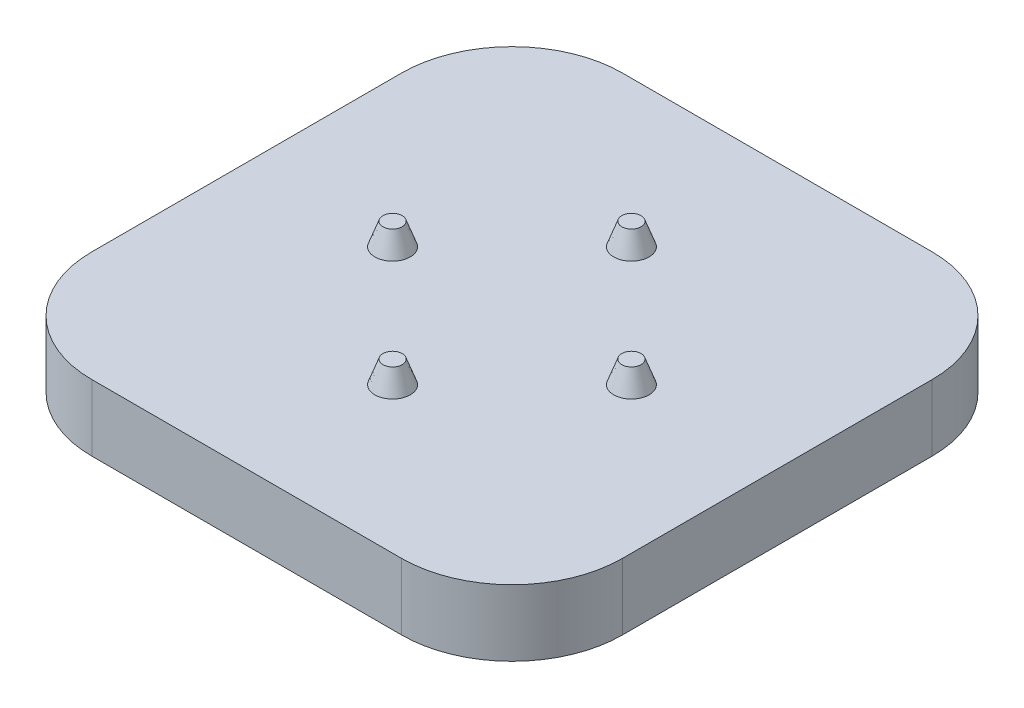
ISO-10303-21;
HEADER;
FILE_DESCRIPTION(('STEP AP214'),'2;1');
FILE_NAME('part.step','',(''),(''),'','','');
FILE_SCHEMA(('AUTOMOTIVE_DESIGN { 1 0 10303 214 1 1 1 1 }'));
ENDSEC;
DATA;
#1=APPLICATION_CONTEXT('core data for automotive mechanical design processes');
#2=APPLICATION_PROTOCOL_DEFINITION('international standard','automotive_design',2000,#1);
#3=PRODUCT_CONTEXT('',#1,'mechanical');
#4=PRODUCT('Part','Part','',(#3));
#5=PRODUCT_RELATED_PRODUCT_CATEGORY('part','',(#4));
#6=PRODUCT_DEFINITION_FORMATION('','',#4);
#7=PRODUCT_DEFINITION_CONTEXT('part definition',#1,'design');
#8=PRODUCT_DEFINITION('design','',#6,#7);
#9=PRODUCT_DEFINITION_SHAPE('','',#8);
#10=(LENGTH_UNIT() NAMED_UNIT(*) SI_UNIT(.MILLI.,.METRE.));
#11=(NAMED_UNIT(*) PLANE_ANGLE_UNIT() SI_UNIT($,.RADIAN.));
#12=(NAMED_UNIT(*) SI_UNIT($,.STERADIAN.) SOLID_ANGLE_UNIT());
#13=UNCERTAINTY_MEASURE_WITH_UNIT(LENGTH_MEASURE(1.E-05),#10,'distance_accuracy_value','');
#14=(GEOMETRIC_REPRESENTATION_CONTEXT(3) GLOBAL_UNCERTAINTY_ASSIGNED_CONTEXT((#13)) GLOBAL_UNIT_ASSIGNED_CONTEXT((#10,
#11,#12)) REPRESENTATION_CONTEXT('',''));
#15=CARTESIAN_POINT('',(0.,0.,0.));
#16=DIRECTION('',(0.,0.,1.));
#17=DIRECTION('',(1.,0.,0.));
#18=AXIS2_PLACEMENT_3D('',#15,#16,#17);
#19=CARTESIAN_POINT('',(-60.,8.22463365791957,-60.));
#20=DIRECTION('',(1.,0.,0.));
#21=DIRECTION('',(0.,0.,-1.));
#22=AXIS2_PLACEMENT_3D('',#19,#20,#21);
#23=PLANE('',#22);
#24=DIRECTION('',(0.,0.,1.));
#25=VECTOR('',#24,1.);
#26=CARTESIAN_POINT('',(-60.,-6.77536634208043,-60.));
#27=LINE('',#26,#25);
#28=CARTESIAN_POINT('',(-60.,-6.77536634208043,-35.));
#29=VERTEX_POINT('',#28);
#30=CARTESIAN_POINT('',(-60.,-6.77536634208043,35.));
#31=VERTEX_POINT('',#30);
#32=EDGE_CURVE('E141',#29,#31,#27,.T.);
#33=ORIENTED_EDGE('',*,*,#32,.T.);
#34=DIRECTION('',(0.,-1.,0.));
#35=VECTOR('',#34,1.);
#36=CARTESIAN_POINT('',(-60.,8.22463365791957,35.));
#37=LINE('',#36,#35);
#38=CARTESIAN_POINT('',(-60.,8.22463365791957,35.));
#39=VERTEX_POINT('',#38);
#40=EDGE_CURVE('E164',#31,#39,#37,.F.);
#41=ORIENTED_EDGE('',*,*,#40,.T.);
#42=DIRECTION('',(0.,0.,1.));
#43=VECTOR('',#42,1.);
#44=CARTESIAN_POINT('',(-60.,8.22463365791957,-60.));
#45=LINE('',#44,#43);
#46=CARTESIAN_POINT('',(-60.,8.22463365791957,-35.));
#47=VERTEX_POINT('',#46);
#48=EDGE_CURVE('E139',#47,#39,#45,.T.);
#49=ORIENTED_EDGE('',*,*,#48,.F.);
#50=DIRECTION('',(0.,-1.,0.));
#51=VECTOR('',#50,1.);
#52=CARTESIAN_POINT('',(-60.,8.22463365791957,-35.));
#53=LINE('',#52,#51);
#54=EDGE_CURVE('E161',#47,#29,#53,.T.);
#55=ORIENTED_EDGE('',*,*,#54,.T.);
#56=EDGE_LOOP('',(#33,#41,#49,#55));
#57=FACE_BOUND('',#56,.T.);
#58=ADVANCED_FACE('F44',(#57),#23,.F.);
#59=CARTESIAN_POINT('',(60.,8.22463365791957,60.));
#60=DIRECTION('',(0.,0.,-1.));
#61=DIRECTION('',(-1.,0.,0.));
#62=AXIS2_PLACEMENT_3D('',#59,#60,#61);
#63=PLANE('',#62);
#64=DIRECTION('',(1.,0.,0.));
#65=VECTOR('',#64,1.);
#66=CARTESIAN_POINT('',(60.,-6.77536634208043,60.));
#67=LINE('',#66,#65);
#68=CARTESIAN_POINT('',(-35.,-6.77536634208043,60.));
#69=VERTEX_POINT('',#68);
#70=CARTESIAN_POINT('',(35.,-6.77536634208043,60.));
#71=VERTEX_POINT('',#70);
#72=EDGE_CURVE('E137',#69,#71,#67,.T.);
#73=ORIENTED_EDGE('',*,*,#72,.T.);
#74=DIRECTION('',(0.,-1.,0.));
#75=VECTOR('',#74,1.);
#76=CARTESIAN_POINT('',(35.,8.22463365791957,60.));
#77=LINE('',#76,#75);
#78=CARTESIAN_POINT('',(35.,8.22463365791957,60.));
#79=VERTEX_POINT('',#78);
#80=EDGE_CURVE('E116',#71,#79,#77,.F.);
#81=ORIENTED_EDGE('',*,*,#80,.T.);
#82=DIRECTION('',(1.,0.,0.));
#83=VECTOR('',#82,1.);
#84=CARTESIAN_POINT('',(60.,8.22463365791957,60.));
#85=LINE('',#84,#83);
#86=CARTESIAN_POINT('',(-35.,8.22463365791957,60.));
#87=VERTEX_POINT('',#86);
#88=EDGE_CURVE('E191',#87,#79,#85,.T.);
#89=ORIENTED_EDGE('',*,*,#88,.F.);
#90=DIRECTION('',(0.,-1.,0.));
#91=VECTOR('',#90,1.);
#92=CARTESIAN_POINT('',(-35.,8.22463365791957,60.));
#93=LINE('',#92,#91);
#94=EDGE_CURVE('E121',#87,#69,#93,.T.);
#95=ORIENTED_EDGE('',*,*,#94,.T.);
#96=EDGE_LOOP('',(#73,#81,#89,#95));
#97=FACE_BOUND('',#96,.T.);
#98=ADVANCED_FACE('F236',(#97),#63,.F.);
#99=CARTESIAN_POINT('',(60.,8.22463365791957,-60.));
#100=DIRECTION('',(-1.,0.,0.));
#101=DIRECTION('',(0.,0.,1.));
#102=AXIS2_PLACEMENT_3D('',#99,#100,#101);
#103=PLANE('',#102);
#104=DIRECTION('',(0.,0.,-1.));
#105=VECTOR('',#104,1.);
#106=CARTESIAN_POINT('',(60.,8.22463365791957,-60.));
#107=LINE('',#106,#105);
#108=CARTESIAN_POINT('',(60.,8.22463365791957,35.));
#109=VERTEX_POINT('',#108);
#110=CARTESIAN_POINT('',(60.,8.22463365791957,-35.));
#111=VERTEX_POINT('',#110);
#112=EDGE_CURVE('E130',#109,#111,#107,.T.);
#113=ORIENTED_EDGE('',*,*,#112,.F.);
#114=DIRECTION('',(0.,-1.,0.));
#115=VECTOR('',#114,1.);
#116=CARTESIAN_POINT('',(60.,8.22463365791957,35.));
#117=LINE('',#116,#115);
#118=CARTESIAN_POINT('',(60.,-6.77536634208043,35.));
#119=VERTEX_POINT('',#118);
#120=EDGE_CURVE('E115',#109,#119,#117,.T.);
#121=ORIENTED_EDGE('',*,*,#120,.T.);
#122=DIRECTION('',(0.,0.,-1.));
#123=VECTOR('',#122,1.);
#124=CARTESIAN_POINT('',(60.,-6.77536634208043,-60.));
#125=LINE('',#124,#123);
#126=CARTESIAN_POINT('',(60.,-6.77536634208043,-35.));
#127=VERTEX_POINT('',#126);
#128=EDGE_CURVE('E128',#119,#127,#125,.T.);
#129=ORIENTED_EDGE('',*,*,#128,.T.);
#130=DIRECTION('',(0.,-1.,0.));
#131=VECTOR('',#130,1.);
#132=CARTESIAN_POINT('',(60.,8.22463365791957,-35.));
#133=LINE('',#132,#131);
#134=EDGE_CURVE('E132',#127,#111,#133,.F.);
#135=ORIENTED_EDGE('',*,*,#134,.T.);
#136=EDGE_LOOP('',(#113,#121,#129,#135));
#137=FACE_BOUND('',#136,.T.);
#138=ADVANCED_FACE('F127',(#137),#103,.F.);
#139=CARTESIAN_POINT('',(60.,8.22463365791957,-60.));
#140=DIRECTION('',(0.,0.,1.));
#141=DIRECTION('',(1.,0.,0.));
#142=AXIS2_PLACEMENT_3D('',#139,#140,#141);
#143=PLANE('',#142);
#144=DIRECTION('',(-1.,0.,0.));
#145=VECTOR('',#144,1.);
#146=CARTESIAN_POINT('',(60.,-6.77536634208043,-60.));
#147=LINE('',#146,#145);
#148=CARTESIAN_POINT('',(35.,-6.77536634208043,-60.));
#149=VERTEX_POINT('',#148);
#150=CARTESIAN_POINT('',(-35.,-6.77536634208043,-60.));
#151=VERTEX_POINT('',#150);
#152=EDGE_CURVE('E136',#149,#151,#147,.T.);
#153=ORIENTED_EDGE('',*,*,#152,.T.);
#154=DIRECTION('',(0.,-1.,0.));
#155=VECTOR('',#154,1.);
#156=CARTESIAN_POINT('',(-35.,8.22463365791957,-60.));
#157=LINE('',#156,#155);
#158=CARTESIAN_POINT('',(-35.,8.22463365791957,-60.));
#159=VERTEX_POINT('',#158);
#160=EDGE_CURVE('E59',#151,#159,#157,.F.);
#161=ORIENTED_EDGE('',*,*,#160,.T.);
#162=DIRECTION('',(-1.,0.,0.));
#163=VECTOR('',#162,1.);
#164=CARTESIAN_POINT('',(60.,8.22463365791957,-60.));
#165=LINE('',#164,#163);
#166=CARTESIAN_POINT('',(35.,8.22463365791957,-60.));
#167=VERTEX_POINT('',#166);
#168=EDGE_CURVE('E145',#167,#159,#165,.T.);
#169=ORIENTED_EDGE('',*,*,#168,.F.);
#170=DIRECTION('',(0.,-1.,0.));
#171=VECTOR('',#170,1.);
#172=CARTESIAN_POINT('',(35.,8.22463365791957,-60.));
#173=LINE('',#172,#171);
#174=EDGE_CURVE('E166',#167,#149,#173,.T.);
#175=ORIENTED_EDGE('',*,*,#174,.T.);
#176=EDGE_LOOP('',(#153,#161,#169,#175));
#177=FACE_BOUND('',#176,.T.);
#178=ADVANCED_FACE('F183',(#177),#143,.F.);
#179=CARTESIAN_POINT('',(0.,8.22463365791957,0.));
#180=DIRECTION('',(0.,-1.,0.));
#181=DIRECTION('',(0.,0.,-1.));
#182=AXIS2_PLACEMENT_3D('',#179,#180,#181);
#183=PLANE('',#182);
#184=CARTESIAN_POINT('',(-27.,8.22463365791957,0.));
#185=DIRECTION('',(0.,-1.,0.));
#186=DIRECTION('',(0.,0.,-1.));
#187=AXIS2_PLACEMENT_3D('',#184,#185,#186);
#188=CIRCLE('',#187,4.);
#189=CARTESIAN_POINT('',(-27.,8.22463365791957,-3.99999999999998));
#190=VERTEX_POINT('',#189);
#191=EDGE_CURVE('E12',#190,#190,#188,.F.);
#192=ORIENTED_EDGE('',*,*,#191,.F.);
#193=EDGE_LOOP('',(#192));
#194=FACE_BOUND('',#193,.T.);
#195=CARTESIAN_POINT('',(0.,8.22463365791957,27.));
#196=DIRECTION('',(0.,-1.,0.));
#197=DIRECTION('',(0.,0.,-1.));
#198=AXIS2_PLACEMENT_3D('',#195,#196,#197);
#199=CIRCLE('',#198,4.);
#200=CARTESIAN_POINT('',(0.,8.22463365791957,23.));
#201=VERTEX_POINT('',#200);
#202=EDGE_CURVE('E52',#201,#201,#199,.F.);
#203=ORIENTED_EDGE('',*,*,#202,.F.);
#204=EDGE_LOOP('',(#203));
#205=FACE_BOUND('',#204,.T.);
#206=CARTESIAN_POINT('',(27.,8.22463365791957,0.));
#207=DIRECTION('',(0.,-1.,0.));
#208=DIRECTION('',(0.,0.,-1.));
#209=AXIS2_PLACEMENT_3D('',#206,#207,#208);
#210=CIRCLE('',#209,4.);
#211=CARTESIAN_POINT('',(27.,8.22463365791957,-3.99999999999998));
#212=VERTEX_POINT('',#211);
#213=EDGE_CURVE('E173',#212,#212,#210,.F.);
#214=ORIENTED_EDGE('',*,*,#213,.F.);
#215=EDGE_LOOP('',(#214));
#216=FACE_BOUND('',#215,.T.);
#217=CARTESIAN_POINT('',(0.,8.22463365791957,-27.));
#218=DIRECTION('',(0.,-1.,0.));
#219=DIRECTION('',(0.,0.,-1.));
#220=AXIS2_PLACEMENT_3D('',#217,#218,#219);
#221=CIRCLE('',#220,4.);
#222=CARTESIAN_POINT('',(0.,8.22463365791957,-31.));
#223=VERTEX_POINT('',#222);
#224=EDGE_CURVE('E170',#223,#223,#221,.F.);
#225=ORIENTED_EDGE('',*,*,#224,.F.);
#226=EDGE_LOOP('',(#225));
#227=FACE_BOUND('',#226,.T.);
#228=ORIENTED_EDGE('',*,*,#88,.T.);
#229=CARTESIAN_POINT('',(35.,8.22463365791957,35.));
#230=DIRECTION('',(0.,-1.,0.));
#231=DIRECTION('',(0.,0.,-1.));
#232=AXIS2_PLACEMENT_3D('',#229,#230,#231);
#233=CIRCLE('',#232,25.);
#234=EDGE_CURVE('E159',#79,#109,#233,.F.);
#235=ORIENTED_EDGE('',*,*,#234,.T.);
#236=ORIENTED_EDGE('',*,*,#112,.T.);
#237=CARTESIAN_POINT('',(35.,8.22463365791957,-35.));
#238=DIRECTION('',(0.,-1.,0.));
#239=DIRECTION('',(0.,0.,-1.));
#240=AXIS2_PLACEMENT_3D('',#237,#238,#239);
#241=CIRCLE('',#240,25.);
#242=EDGE_CURVE('E66',#111,#167,#241,.F.);
#243=ORIENTED_EDGE('',*,*,#242,.T.);
#244=ORIENTED_EDGE('',*,*,#168,.T.);
#245=CARTESIAN_POINT('',(-35.,8.22463365791957,-35.));
#246=DIRECTION('',(0.,-1.,0.));
#247=DIRECTION('',(0.,0.,-1.));
#248=AXIS2_PLACEMENT_3D('',#245,#246,#247);
#249=CIRCLE('',#248,25.);
#250=EDGE_CURVE('E155',#159,#47,#249,.F.);
#251=ORIENTED_EDGE('',*,*,#250,.T.);
#252=ORIENTED_EDGE('',*,*,#48,.T.);
#253=CARTESIAN_POINT('',(-35.,8.22463365791957,35.));
#254=DIRECTION('',(0.,-1.,0.));
#255=DIRECTION('',(0.,0.,-1.));
#256=AXIS2_PLACEMENT_3D('',#253,#254,#255);
#257=CIRCLE('',#256,25.);
#258=EDGE_CURVE('E157',#39,#87,#257,.F.);
#259=ORIENTED_EDGE('',*,*,#258,.T.);
#260=EDGE_LOOP('',(#228,#235,#236,#243,#244,#251,#252,#259));
#261=FACE_BOUND('',#260,.T.);
#262=ADVANCED_FACE('F180',(#194,#205,#216,#227,#261),#183,.F.);
#263=CARTESIAN_POINT('',(0.,-6.77536634208043,0.));
#264=DIRECTION('',(0.,-1.,0.));
#265=DIRECTION('',(0.,0.,-1.));
#266=AXIS2_PLACEMENT_3D('',#263,#264,#265);
#267=PLANE('',#266);
#268=ORIENTED_EDGE('',*,*,#128,.F.);
#269=CARTESIAN_POINT('',(35.,-6.77536634208043,35.));
#270=DIRECTION('',(0.,-1.,0.));
#271=DIRECTION('',(0.,0.,-1.));
#272=AXIS2_PLACEMENT_3D('',#269,#270,#271);
#273=CIRCLE('',#272,25.);
#274=EDGE_CURVE('E111',#119,#71,#273,.T.);
#275=ORIENTED_EDGE('',*,*,#274,.T.);
#276=ORIENTED_EDGE('',*,*,#72,.F.);
#277=CARTESIAN_POINT('',(-35.,-6.77536634208043,35.));
#278=DIRECTION('',(0.,-1.,0.));
#279=DIRECTION('',(0.,0.,-1.));
#280=AXIS2_PLACEMENT_3D('',#277,#278,#279);
#281=CIRCLE('',#280,25.);
#282=EDGE_CURVE('E122',#69,#31,#281,.T.);
#283=ORIENTED_EDGE('',*,*,#282,.T.);
#284=ORIENTED_EDGE('',*,*,#32,.F.);
#285=CARTESIAN_POINT('',(-35.,-6.77536634208043,-35.));
#286=DIRECTION('',(0.,-1.,0.));
#287=DIRECTION('',(0.,0.,-1.));
#288=AXIS2_PLACEMENT_3D('',#285,#286,#287);
#289=CIRCLE('',#288,25.);
#290=EDGE_CURVE('E148',#29,#151,#289,.T.);
#291=ORIENTED_EDGE('',*,*,#290,.T.);
#292=ORIENTED_EDGE('',*,*,#152,.F.);
#293=CARTESIAN_POINT('',(35.,-6.77536634208043,-35.));
#294=DIRECTION('',(0.,-1.,0.));
#295=DIRECTION('',(0.,0.,-1.));
#296=AXIS2_PLACEMENT_3D('',#293,#294,#295);
#297=CIRCLE('',#296,25.);
#298=EDGE_CURVE('E131',#149,#127,#297,.T.);
#299=ORIENTED_EDGE('',*,*,#298,.T.);
#300=EDGE_LOOP('',(#268,#275,#276,#283,#284,#291,#292,#299));
#301=FACE_BOUND('',#300,.T.);
#302=ADVANCED_FACE('F134',(#301),#267,.T.);
#303=CARTESIAN_POINT('',(35.,8.22463365791957,35.));
#304=DIRECTION('',(0.,-1.,0.));
#305=DIRECTION('',(0.,0.,-1.));
#306=AXIS2_PLACEMENT_3D('',#303,#304,#305);
#307=CYLINDRICAL_SURFACE('',#306,25.);
#308=ORIENTED_EDGE('',*,*,#234,.F.);
#309=ORIENTED_EDGE('',*,*,#80,.F.);
#310=ORIENTED_EDGE('',*,*,#274,.F.);
#311=ORIENTED_EDGE('',*,*,#120,.F.);
#312=EDGE_LOOP('',(#308,#309,#310,#311));
#313=FACE_BOUND('',#312,.T.);
#314=ADVANCED_FACE('F114',(#313),#307,.T.);
#315=CARTESIAN_POINT('',(-35.,8.22463365791957,35.));
#316=DIRECTION('',(0.,-1.,0.));
#317=DIRECTION('',(0.,0.,-1.));
#318=AXIS2_PLACEMENT_3D('',#315,#316,#317);
#319=CYLINDRICAL_SURFACE('',#318,25.);
#320=ORIENTED_EDGE('',*,*,#258,.F.);
#321=ORIENTED_EDGE('',*,*,#40,.F.);
#322=ORIENTED_EDGE('',*,*,#282,.F.);
#323=ORIENTED_EDGE('',*,*,#94,.F.);
#324=EDGE_LOOP('',(#320,#321,#322,#323));
#325=FACE_BOUND('',#324,.T.);
#326=ADVANCED_FACE('F246',(#325),#319,.T.);
#327=CARTESIAN_POINT('',(-35.,8.22463365791957,-35.));
#328=DIRECTION('',(0.,-1.,0.));
#329=DIRECTION('',(0.,0.,-1.));
#330=AXIS2_PLACEMENT_3D('',#327,#328,#329);
#331=CYLINDRICAL_SURFACE('',#330,25.);
#332=ORIENTED_EDGE('',*,*,#250,.F.);
#333=ORIENTED_EDGE('',*,*,#160,.F.);
#334=ORIENTED_EDGE('',*,*,#290,.F.);
#335=ORIENTED_EDGE('',*,*,#54,.F.);
#336=EDGE_LOOP('',(#332,#333,#334,#335));
#337=FACE_BOUND('',#336,.T.);
#338=ADVANCED_FACE('F232',(#337),#331,.T.);
#339=CARTESIAN_POINT('',(35.,8.22463365791957,-35.));
#340=DIRECTION('',(0.,-1.,0.));
#341=DIRECTION('',(0.,0.,-1.));
#342=AXIS2_PLACEMENT_3D('',#339,#340,#341);
#343=CYLINDRICAL_SURFACE('',#342,25.);
#344=ORIENTED_EDGE('',*,*,#242,.F.);
#345=ORIENTED_EDGE('',*,*,#134,.F.);
#346=ORIENTED_EDGE('',*,*,#298,.F.);
#347=ORIENTED_EDGE('',*,*,#174,.F.);
#348=EDGE_LOOP('',(#344,#345,#346,#347));
#349=FACE_BOUND('',#348,.T.);
#350=ADVANCED_FACE('F46',(#349),#343,.T.);
#351=CARTESIAN_POINT('',(0.,8.22463365791957,-27.));
#352=DIRECTION('',(0.,-1.,0.));
#353=DIRECTION('',(0.,0.,1.));
#354=AXIS2_PLACEMENT_3D('',#351,#352,#353);
#355=CONICAL_SURFACE('',#354,4.,0.349065850398867);
#356=CARTESIAN_POINT('',(0.,13.2246336579196,-27.));
#357=DIRECTION('',(0.,1.,0.));
#358=DIRECTION('',(0.,0.,1.));
#359=AXIS2_PLACEMENT_3D('',#356,#357,#358);
#360=CIRCLE('',#359,2.18014882866898);
#361=CARTESIAN_POINT('',(0.,13.2246336579196,-24.819851171331));
#362=VERTEX_POINT('',#361);
#363=EDGE_CURVE('E216',#362,#362,#360,.T.);
#364=ORIENTED_EDGE('',*,*,#363,.F.);
#365=EDGE_LOOP('',(#364));
#366=FACE_BOUND('',#365,.T.);
#367=ORIENTED_EDGE('',*,*,#224,.T.);
#368=EDGE_LOOP('',(#367));
#369=FACE_BOUND('',#368,.T.);
#370=ADVANCED_FACE('F222',(#366,#369),#355,.T.);
#371=CARTESIAN_POINT('',(0.,13.2246336579196,-27.));
#372=DIRECTION('',(0.,1.,0.));
#373=DIRECTION('',(0.,0.,1.));
#374=AXIS2_PLACEMENT_3D('',#371,#372,#373);
#375=PLANE('',#374);
#376=ORIENTED_EDGE('',*,*,#363,.T.);
#377=EDGE_LOOP('',(#376));
#378=FACE_BOUND('',#377,.T.);
#379=ADVANCED_FACE('F220',(#378),#375,.T.);
#380=CARTESIAN_POINT('',(27.,8.22463365791957,0.));
#381=DIRECTION('',(0.,-1.,0.));
#382=DIRECTION('',(0.,0.,1.));
#383=AXIS2_PLACEMENT_3D('',#380,#381,#382);
#384=CONICAL_SURFACE('',#383,4.,0.349065850398867);
#385=CARTESIAN_POINT('',(27.,13.2246336579196,0.));
#386=DIRECTION('',(0.,1.,0.));
#387=DIRECTION('',(0.,0.,1.));
#388=AXIS2_PLACEMENT_3D('',#385,#386,#387);
#389=CIRCLE('',#388,2.18014882866899);
#390=CARTESIAN_POINT('',(27.,13.2246336579196,2.18014882866901));
#391=VERTEX_POINT('',#390);
#392=EDGE_CURVE('E212',#391,#391,#389,.T.);
#393=ORIENTED_EDGE('',*,*,#392,.F.);
#394=EDGE_LOOP('',(#393));
#395=FACE_BOUND('',#394,.T.);
#396=ORIENTED_EDGE('',*,*,#213,.T.);
#397=EDGE_LOOP('',(#396));
#398=FACE_BOUND('',#397,.T.);
#399=ADVANCED_FACE('F230',(#395,#398),#384,.T.);
#400=CARTESIAN_POINT('',(27.,13.2246336579196,0.));
#401=DIRECTION('',(0.,1.,0.));
#402=DIRECTION('',(0.,0.,1.));
#403=AXIS2_PLACEMENT_3D('',#400,#401,#402);
#404=PLANE('',#403);
#405=ORIENTED_EDGE('',*,*,#392,.T.);
#406=EDGE_LOOP('',(#405));
#407=FACE_BOUND('',#406,.T.);
#408=ADVANCED_FACE('F308',(#407),#404,.T.);
#409=CARTESIAN_POINT('',(0.,8.22463365791957,27.));
#410=DIRECTION('',(0.,-1.,0.));
#411=DIRECTION('',(0.,0.,1.));
#412=AXIS2_PLACEMENT_3D('',#409,#410,#411);
#413=CONICAL_SURFACE('',#412,4.,0.349065850398867);
#414=CARTESIAN_POINT('',(0.,13.2246336579196,27.));
#415=DIRECTION('',(0.,1.,0.));
#416=DIRECTION('',(0.,0.,1.));
#417=AXIS2_PLACEMENT_3D('',#414,#415,#416);
#418=CIRCLE('',#417,2.18014882866899);
#419=CARTESIAN_POINT('',(0.,13.2246336579196,29.180148828669));
#420=VERTEX_POINT('',#419);
#421=EDGE_CURVE('E207',#420,#420,#418,.T.);
#422=ORIENTED_EDGE('',*,*,#421,.F.);
#423=EDGE_LOOP('',(#422));
#424=FACE_BOUND('',#423,.T.);
#425=ORIENTED_EDGE('',*,*,#202,.T.);
#426=EDGE_LOOP('',(#425));
#427=FACE_BOUND('',#426,.T.);
#428=ADVANCED_FACE('F178',(#424,#427),#413,.T.);
#429=CARTESIAN_POINT('',(0.,13.2246336579196,27.));
#430=DIRECTION('',(0.,1.,0.));
#431=DIRECTION('',(0.,0.,1.));
#432=AXIS2_PLACEMENT_3D('',#429,#430,#431);
#433=PLANE('',#432);
#434=ORIENTED_EDGE('',*,*,#421,.T.);
#435=EDGE_LOOP('',(#434));
#436=FACE_BOUND('',#435,.T.);
#437=ADVANCED_FACE('F326',(#436),#433,.T.);
#438=CARTESIAN_POINT('',(-27.,8.22463365791957,0.));
#439=DIRECTION('',(0.,-1.,0.));
#440=DIRECTION('',(0.,0.,1.));
#441=AXIS2_PLACEMENT_3D('',#438,#439,#440);
#442=CONICAL_SURFACE('',#441,4.,0.349065850398867);
#443=CARTESIAN_POINT('',(-27.,13.2246336579196,0.));
#444=DIRECTION('',(0.,1.,0.));
#445=DIRECTION('',(0.,0.,1.));
#446=AXIS2_PLACEMENT_3D('',#443,#444,#445);
#447=CIRCLE('',#446,2.18014882866899);
#448=CARTESIAN_POINT('',(-27.,13.2246336579196,2.18014882866901));
#449=VERTEX_POINT('',#448);
#450=EDGE_CURVE('E202',#449,#449,#447,.T.);
#451=ORIENTED_EDGE('',*,*,#450,.F.);
#452=EDGE_LOOP('',(#451));
#453=FACE_BOUND('',#452,.T.);
#454=ORIENTED_EDGE('',*,*,#191,.T.);
#455=EDGE_LOOP('',(#454));
#456=FACE_BOUND('',#455,.T.);
#457=ADVANCED_FACE('F336',(#453,#456),#442,.T.);
#458=CARTESIAN_POINT('',(-27.,13.2246336579196,0.));
#459=DIRECTION('',(0.,1.,0.));
#460=DIRECTION('',(0.,0.,1.));
#461=AXIS2_PLACEMENT_3D('',#458,#459,#460);
#462=PLANE('',#461);
#463=ORIENTED_EDGE('',*,*,#450,.T.);
#464=EDGE_LOOP('',(#463));
#465=FACE_BOUND('',#464,.T.);
#466=ADVANCED_FACE('F346',(#465),#462,.T.);
#467=CLOSED_SHELL('',(#58,#98,#138,#178,#262,#302,#314,#326,#338,#350,#370,#379,#399,#408,#428,
#437,#457,#466));
#468=MANIFOLD_SOLID_BREP('B2',#467);
#469=ADVANCED_BREP_SHAPE_REPRESENTATION('',(#18,#468),#14);
#470=SHAPE_DEFINITION_REPRESENTATION(#9,#469);
ENDSEC;
END-ISO-10303-21;
